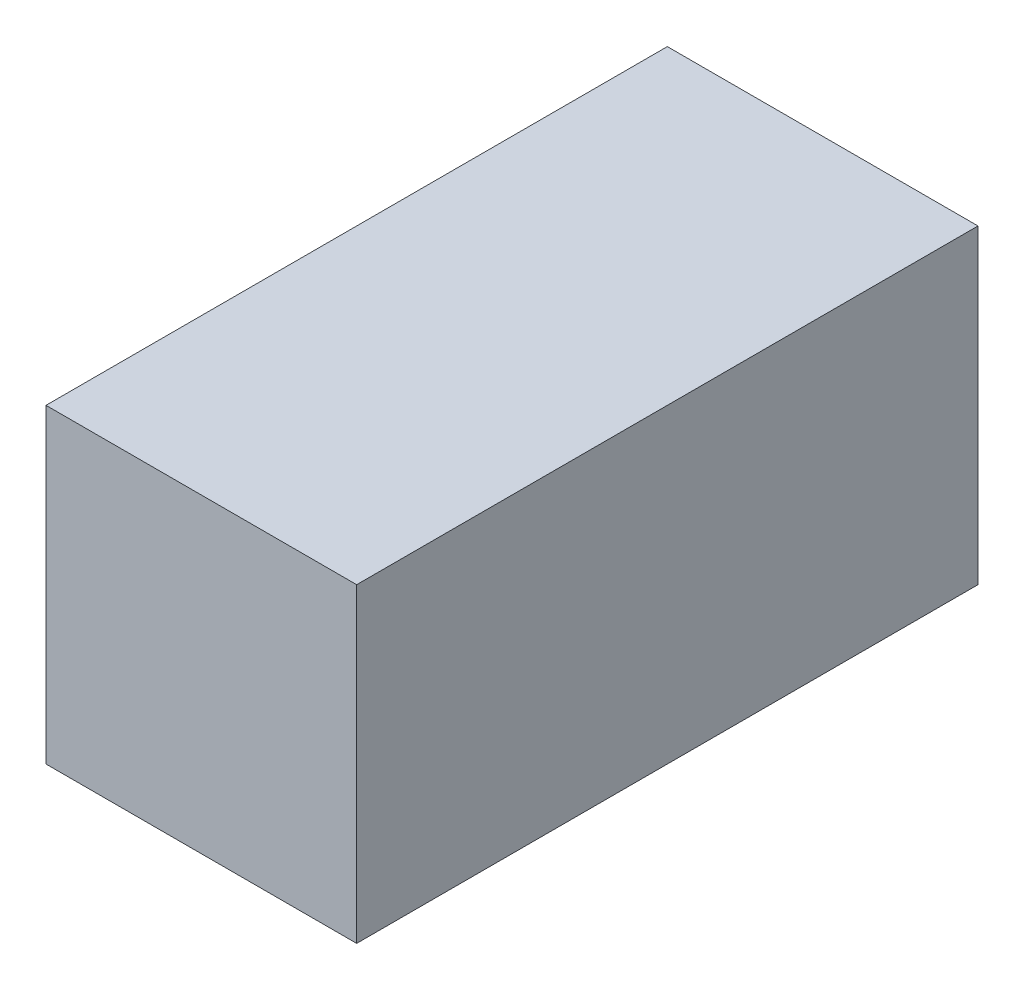
ISO-10303-21;
HEADER;
FILE_DESCRIPTION(('STEP AP214'),'2;1');
FILE_NAME('part.step','',(''),(''),'','','');
FILE_SCHEMA(('AUTOMOTIVE_DESIGN { 1 0 10303 214 1 1 1 1 }'));
ENDSEC;
DATA;
#1=APPLICATION_CONTEXT('core data for automotive mechanical design processes');
#2=APPLICATION_PROTOCOL_DEFINITION('international standard','automotive_design',2000,#1);
#3=PRODUCT_CONTEXT('',#1,'mechanical');
#4=PRODUCT('Part','Part','',(#3));
#5=PRODUCT_RELATED_PRODUCT_CATEGORY('part','',(#4));
#6=PRODUCT_DEFINITION_FORMATION('','',#4);
#7=PRODUCT_DEFINITION_CONTEXT('part definition',#1,'design');
#8=PRODUCT_DEFINITION('design','',#6,#7);
#9=PRODUCT_DEFINITION_SHAPE('','',#8);
#10=(LENGTH_UNIT() NAMED_UNIT(*) SI_UNIT(.MILLI.,.METRE.));
#11=(NAMED_UNIT(*) PLANE_ANGLE_UNIT() SI_UNIT($,.RADIAN.));
#12=(NAMED_UNIT(*) SI_UNIT($,.STERADIAN.) SOLID_ANGLE_UNIT());
#13=UNCERTAINTY_MEASURE_WITH_UNIT(LENGTH_MEASURE(1.E-05),#10,'distance_accuracy_value','');
#14=(GEOMETRIC_REPRESENTATION_CONTEXT(3) GLOBAL_UNCERTAINTY_ASSIGNED_CONTEXT((#13)) GLOBAL_UNIT_ASSIGNED_CONTEXT((#10,
#11,#12)) REPRESENTATION_CONTEXT('',''));
#15=CARTESIAN_POINT('',(0.,0.,0.));
#16=DIRECTION('',(0.,0.,1.));
#17=DIRECTION('',(1.,0.,0.));
#18=AXIS2_PLACEMENT_3D('',#15,#16,#17);
#19=CARTESIAN_POINT('',(5.,5.,10.));
#20=DIRECTION('',(-1.,0.,0.));
#21=DIRECTION('',(0.,0.,1.));
#22=AXIS2_PLACEMENT_3D('',#19,#20,#21);
#23=PLANE('',#22);
#24=DIRECTION('',(0.,0.,-1.));
#25=VECTOR('',#24,1.);
#26=CARTESIAN_POINT('',(5.,-5.,10.));
#27=LINE('',#26,#25);
#28=CARTESIAN_POINT('',(5.,-5.,10.));
#29=VERTEX_POINT('',#28);
#30=CARTESIAN_POINT('',(5.,-5.,-10.));
#31=VERTEX_POINT('',#30);
#32=EDGE_CURVE('E96',#29,#31,#27,.T.);
#33=ORIENTED_EDGE('',*,*,#32,.T.);
#34=DIRECTION('',(0.,-1.,0.));
#35=VECTOR('',#34,1.);
#36=CARTESIAN_POINT('',(5.,5.,-10.));
#37=LINE('',#36,#35);
#38=CARTESIAN_POINT('',(5.,5.,-10.));
#39=VERTEX_POINT('',#38);
#40=EDGE_CURVE('E11',#39,#31,#37,.T.);
#41=ORIENTED_EDGE('',*,*,#40,.F.);
#42=DIRECTION('',(0.,0.,-1.));
#43=VECTOR('',#42,1.);
#44=CARTESIAN_POINT('',(5.,5.,10.));
#45=LINE('',#44,#43);
#46=CARTESIAN_POINT('',(5.,5.,10.));
#47=VERTEX_POINT('',#46);
#48=EDGE_CURVE('E84',#47,#39,#45,.T.);
#49=ORIENTED_EDGE('',*,*,#48,.F.);
#50=DIRECTION('',(0.,-1.,0.));
#51=VECTOR('',#50,1.);
#52=CARTESIAN_POINT('',(5.,5.,10.));
#53=LINE('',#52,#51);
#54=EDGE_CURVE('E92',#47,#29,#53,.T.);
#55=ORIENTED_EDGE('',*,*,#54,.T.);
#56=EDGE_LOOP('',(#33,#41,#49,#55));
#57=FACE_BOUND('',#56,.T.);
#58=ADVANCED_FACE('F33',(#57),#23,.F.);
#59=CARTESIAN_POINT('',(-5.,5.,-10.));
#60=DIRECTION('',(0.,0.,1.));
#61=DIRECTION('',(1.,0.,0.));
#62=AXIS2_PLACEMENT_3D('',#59,#60,#61);
#63=PLANE('',#62);
#64=DIRECTION('',(-1.,0.,0.));
#65=VECTOR('',#64,1.);
#66=CARTESIAN_POINT('',(-5.,-5.,-10.));
#67=LINE('',#66,#65);
#68=CARTESIAN_POINT('',(-5.,-5.,-10.));
#69=VERTEX_POINT('',#68);
#70=EDGE_CURVE('E88',#31,#69,#67,.T.);
#71=ORIENTED_EDGE('',*,*,#70,.T.);
#72=DIRECTION('',(0.,-1.,0.));
#73=VECTOR('',#72,1.);
#74=CARTESIAN_POINT('',(-5.,5.,-10.));
#75=LINE('',#74,#73);
#76=CARTESIAN_POINT('',(-5.,5.,-10.));
#77=VERTEX_POINT('',#76);
#78=EDGE_CURVE('E41',#77,#69,#75,.T.);
#79=ORIENTED_EDGE('',*,*,#78,.F.);
#80=DIRECTION('',(-1.,0.,0.));
#81=VECTOR('',#80,1.);
#82=CARTESIAN_POINT('',(-5.,5.,-10.));
#83=LINE('',#82,#81);
#84=EDGE_CURVE('E79',#39,#77,#83,.T.);
#85=ORIENTED_EDGE('',*,*,#84,.F.);
#86=ORIENTED_EDGE('',*,*,#40,.T.);
#87=EDGE_LOOP('',(#71,#79,#85,#86));
#88=FACE_BOUND('',#87,.T.);
#89=ADVANCED_FACE('F87',(#88),#63,.F.);
#90=CARTESIAN_POINT('',(-5.,5.,10.));
#91=DIRECTION('',(1.,0.,0.));
#92=DIRECTION('',(0.,0.,-1.));
#93=AXIS2_PLACEMENT_3D('',#90,#91,#92);
#94=PLANE('',#93);
#95=DIRECTION('',(0.,0.,1.));
#96=VECTOR('',#95,1.);
#97=CARTESIAN_POINT('',(-5.,-5.,10.));
#98=LINE('',#97,#96);
#99=CARTESIAN_POINT('',(-5.,-5.,10.));
#100=VERTEX_POINT('',#99);
#101=EDGE_CURVE('E66',#69,#100,#98,.T.);
#102=ORIENTED_EDGE('',*,*,#101,.T.);
#103=DIRECTION('',(0.,-1.,0.));
#104=VECTOR('',#103,1.);
#105=CARTESIAN_POINT('',(-5.,5.,10.));
#106=LINE('',#105,#104);
#107=CARTESIAN_POINT('',(-5.,5.,10.));
#108=VERTEX_POINT('',#107);
#109=EDGE_CURVE('E89',#108,#100,#106,.T.);
#110=ORIENTED_EDGE('',*,*,#109,.F.);
#111=DIRECTION('',(0.,0.,1.));
#112=VECTOR('',#111,1.);
#113=CARTESIAN_POINT('',(-5.,5.,10.));
#114=LINE('',#113,#112);
#115=EDGE_CURVE('E82',#77,#108,#114,.T.);
#116=ORIENTED_EDGE('',*,*,#115,.F.);
#117=ORIENTED_EDGE('',*,*,#78,.T.);
#118=EDGE_LOOP('',(#102,#110,#116,#117));
#119=FACE_BOUND('',#118,.T.);
#120=ADVANCED_FACE('F90',(#119),#94,.F.);
#121=CARTESIAN_POINT('',(-5.,5.,10.));
#122=DIRECTION('',(0.,0.,-1.));
#123=DIRECTION('',(-1.,0.,0.));
#124=AXIS2_PLACEMENT_3D('',#121,#122,#123);
#125=PLANE('',#124);
#126=DIRECTION('',(1.,0.,0.));
#127=VECTOR('',#126,1.);
#128=CARTESIAN_POINT('',(-5.,-5.,10.));
#129=LINE('',#128,#127);
#130=EDGE_CURVE('E72',#100,#29,#129,.T.);
#131=ORIENTED_EDGE('',*,*,#130,.T.);
#132=ORIENTED_EDGE('',*,*,#54,.F.);
#133=DIRECTION('',(1.,0.,0.));
#134=VECTOR('',#133,1.);
#135=CARTESIAN_POINT('',(-5.,5.,10.));
#136=LINE('',#135,#134);
#137=EDGE_CURVE('E49',#108,#47,#136,.T.);
#138=ORIENTED_EDGE('',*,*,#137,.F.);
#139=ORIENTED_EDGE('',*,*,#109,.T.);
#140=EDGE_LOOP('',(#131,#132,#138,#139));
#141=FACE_BOUND('',#140,.T.);
#142=ADVANCED_FACE('F103',(#141),#125,.F.);
#143=CARTESIAN_POINT('',(0.,5.,0.));
#144=DIRECTION('',(0.,-1.,0.));
#145=DIRECTION('',(0.,0.,-1.));
#146=AXIS2_PLACEMENT_3D('',#143,#144,#145);
#147=PLANE('',#146);
#148=ORIENTED_EDGE('',*,*,#48,.T.);
#149=ORIENTED_EDGE('',*,*,#84,.T.);
#150=ORIENTED_EDGE('',*,*,#115,.T.);
#151=ORIENTED_EDGE('',*,*,#137,.T.);
#152=EDGE_LOOP('',(#148,#149,#150,#151));
#153=FACE_BOUND('',#152,.T.);
#154=ADVANCED_FACE('F80',(#153),#147,.F.);
#155=CARTESIAN_POINT('',(0.,-5.,0.));
#156=DIRECTION('',(0.,-1.,0.));
#157=DIRECTION('',(0.,0.,-1.));
#158=AXIS2_PLACEMENT_3D('',#155,#156,#157);
#159=PLANE('',#158);
#160=ORIENTED_EDGE('',*,*,#32,.F.);
#161=ORIENTED_EDGE('',*,*,#130,.F.);
#162=ORIENTED_EDGE('',*,*,#101,.F.);
#163=ORIENTED_EDGE('',*,*,#70,.F.);
#164=EDGE_LOOP('',(#160,#161,#162,#163));
#165=FACE_BOUND('',#164,.T.);
#166=ADVANCED_FACE('F106',(#165),#159,.T.);
#167=CLOSED_SHELL('',(#58,#89,#120,#142,#154,#166));
#168=MANIFOLD_SOLID_BREP('B2',#167);
#169=ADVANCED_BREP_SHAPE_REPRESENTATION('',(#18,#168),#14);
#170=SHAPE_DEFINITION_REPRESENTATION(#9,#169);
ENDSEC;
END-ISO-10303-21;
